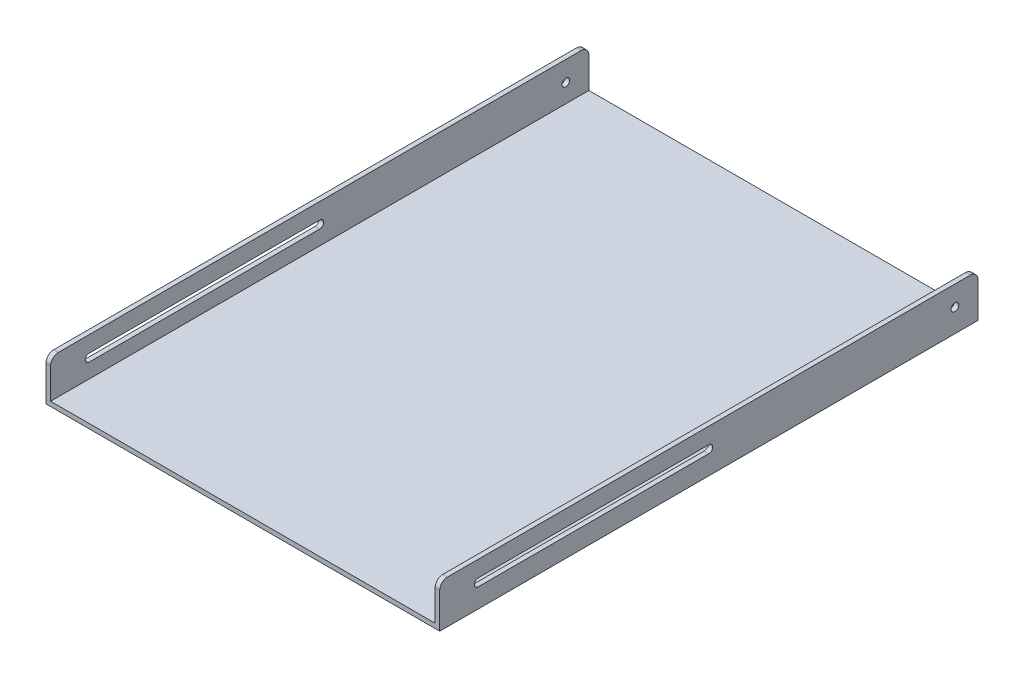
ISO-10303-21;
HEADER;
FILE_DESCRIPTION(('STEP AP214'),'2;1');
FILE_NAME('part.step','',(''),(''),'','','');
FILE_SCHEMA(('AUTOMOTIVE_DESIGN { 1 0 10303 214 1 1 1 1 }'));
ENDSEC;
DATA;
#1=APPLICATION_CONTEXT('core data for automotive mechanical design processes');
#2=APPLICATION_PROTOCOL_DEFINITION('international standard','automotive_design',2000,#1);
#3=PRODUCT_CONTEXT('',#1,'mechanical');
#4=PRODUCT('Part','Part','',(#3));
#5=PRODUCT_RELATED_PRODUCT_CATEGORY('part','',(#4));
#6=PRODUCT_DEFINITION_FORMATION('','',#4);
#7=PRODUCT_DEFINITION_CONTEXT('part definition',#1,'design');
#8=PRODUCT_DEFINITION('design','',#6,#7);
#9=PRODUCT_DEFINITION_SHAPE('','',#8);
#10=(LENGTH_UNIT() NAMED_UNIT(*) SI_UNIT(.MILLI.,.METRE.));
#11=(NAMED_UNIT(*) PLANE_ANGLE_UNIT() SI_UNIT($,.RADIAN.));
#12=(NAMED_UNIT(*) SI_UNIT($,.STERADIAN.) SOLID_ANGLE_UNIT());
#13=UNCERTAINTY_MEASURE_WITH_UNIT(LENGTH_MEASURE(1.E-05),#10,'distance_accuracy_value','');
#14=(GEOMETRIC_REPRESENTATION_CONTEXT(3) GLOBAL_UNCERTAINTY_ASSIGNED_CONTEXT((#13)) GLOBAL_UNIT_ASSIGNED_CONTEXT((#10,
#11,#12)) REPRESENTATION_CONTEXT('',''));
#15=CARTESIAN_POINT('',(0.,0.,0.));
#16=DIRECTION('',(0.,0.,1.));
#17=DIRECTION('',(1.,0.,0.));
#18=AXIS2_PLACEMENT_3D('',#15,#16,#17);
#19=CARTESIAN_POINT('',(256.,0.,350.));
#20=DIRECTION('',(-1.,0.,0.));
#21=DIRECTION('',(0.,0.,1.));
#22=AXIS2_PLACEMENT_3D('',#19,#20,#21);
#23=PLANE('',#22);
#24=CARTESIAN_POINT('',(256.,24.,-320.));
#25=DIRECTION('',(1.,0.,0.));
#26=DIRECTION('',(0.,0.,-1.));
#27=AXIS2_PLACEMENT_3D('',#24,#25,#26);
#28=CIRCLE('',#27,4.99999999999999);
#29=CARTESIAN_POINT('',(256.,24.,-325.));
#30=VERTEX_POINT('',#29);
#31=EDGE_CURVE('E210',#30,#30,#28,.T.);
#32=ORIENTED_EDGE('',*,*,#31,.F.);
#33=EDGE_LOOP('',(#32));
#34=FACE_BOUND('',#33,.T.);
#35=DIRECTION('',(0.,0.,-1.));
#36=VECTOR('',#35,1.);
#37=CARTESIAN_POINT('',(256.,19.,300.));
#38=LINE('',#37,#36);
#39=CARTESIAN_POINT('',(256.,19.,300.));
#40=VERTEX_POINT('',#39);
#41=CARTESIAN_POINT('',(256.,19.,0.));
#42=VERTEX_POINT('',#41);
#43=EDGE_CURVE('E217',#40,#42,#38,.T.);
#44=ORIENTED_EDGE('',*,*,#43,.F.);
#45=CARTESIAN_POINT('',(256.,24.,300.));
#46=DIRECTION('',(1.,0.,0.));
#47=DIRECTION('',(0.,0.,-1.));
#48=AXIS2_PLACEMENT_3D('',#45,#46,#47);
#49=CIRCLE('',#48,5.);
#50=CARTESIAN_POINT('',(256.,29.,300.));
#51=VERTEX_POINT('',#50);
#52=EDGE_CURVE('E215',#51,#40,#49,.T.);
#53=ORIENTED_EDGE('',*,*,#52,.F.);
#54=DIRECTION('',(0.,0.,1.));
#55=VECTOR('',#54,1.);
#56=CARTESIAN_POINT('',(256.,29.,300.));
#57=LINE('',#56,#55);
#58=CARTESIAN_POINT('',(256.,29.,0.));
#59=VERTEX_POINT('',#58);
#60=EDGE_CURVE('E204',#59,#51,#57,.T.);
#61=ORIENTED_EDGE('',*,*,#60,.F.);
#62=CARTESIAN_POINT('',(256.,24.,0.));
#63=DIRECTION('',(1.,0.,0.));
#64=DIRECTION('',(0.,0.,-1.));
#65=AXIS2_PLACEMENT_3D('',#62,#63,#64);
#66=CIRCLE('',#65,5.);
#67=EDGE_CURVE('E207',#42,#59,#66,.T.);
#68=ORIENTED_EDGE('',*,*,#67,.F.);
#69=EDGE_LOOP('',(#44,#53,#61,#68));
#70=FACE_BOUND('',#69,.T.);
#71=DIRECTION('',(0.,0.,-1.));
#72=VECTOR('',#71,1.);
#73=CARTESIAN_POINT('',(256.,50.,350.));
#74=LINE('',#73,#72);
#75=CARTESIAN_POINT('',(256.,50.,340.));
#76=VERTEX_POINT('',#75);
#77=CARTESIAN_POINT('',(256.,50.,-340.));
#78=VERTEX_POINT('',#77);
#79=EDGE_CURVE('E302',#76,#78,#74,.T.);
#80=ORIENTED_EDGE('',*,*,#79,.F.);
#81=CARTESIAN_POINT('',(256.,40.,340.));
#82=DIRECTION('',(-1.,0.,0.));
#83=DIRECTION('',(0.,0.,1.));
#84=AXIS2_PLACEMENT_3D('',#81,#82,#83);
#85=CIRCLE('',#84,10.);
#86=CARTESIAN_POINT('',(256.,40.,350.));
#87=VERTEX_POINT('',#86);
#88=EDGE_CURVE('E312',#76,#87,#85,.F.);
#89=ORIENTED_EDGE('',*,*,#88,.T.);
#90=DIRECTION('',(0.,1.,0.));
#91=VECTOR('',#90,1.);
#92=CARTESIAN_POINT('',(256.,0.,350.));
#93=LINE('',#92,#91);
#94=CARTESIAN_POINT('',(256.,-6.,350.));
#95=VERTEX_POINT('',#94);
#96=EDGE_CURVE('E254',#95,#87,#93,.T.);
#97=ORIENTED_EDGE('',*,*,#96,.F.);
#98=DIRECTION('',(0.,0.,-1.));
#99=VECTOR('',#98,1.);
#100=CARTESIAN_POINT('',(256.,-6.,350.));
#101=LINE('',#100,#99);
#102=CARTESIAN_POINT('',(256.,-6.,-350.));
#103=VERTEX_POINT('',#102);
#104=EDGE_CURVE('E270',#95,#103,#101,.T.);
#105=ORIENTED_EDGE('',*,*,#104,.T.);
#106=DIRECTION('',(0.,1.,0.));
#107=VECTOR('',#106,1.);
#108=CARTESIAN_POINT('',(256.,0.,-350.));
#109=LINE('',#108,#107);
#110=CARTESIAN_POINT('',(256.,40.,-350.));
#111=VERTEX_POINT('',#110);
#112=EDGE_CURVE('E253',#103,#111,#109,.T.);
#113=ORIENTED_EDGE('',*,*,#112,.T.);
#114=CARTESIAN_POINT('',(256.,40.,-340.));
#115=DIRECTION('',(-1.,0.,0.));
#116=DIRECTION('',(0.,0.,1.));
#117=AXIS2_PLACEMENT_3D('',#114,#115,#116);
#118=CIRCLE('',#117,10.);
#119=EDGE_CURVE('E310',#111,#78,#118,.F.);
#120=ORIENTED_EDGE('',*,*,#119,.T.);
#121=EDGE_LOOP('',(#80,#89,#97,#105,#113,#120));
#122=FACE_BOUND('',#121,.T.);
#123=ADVANCED_FACE('F39',(#34,#70,#122),#23,.F.);
#124=CARTESIAN_POINT('',(250.,50.,350.));
#125=DIRECTION('',(0.,1.,0.));
#126=DIRECTION('',(0.,0.,1.));
#127=AXIS2_PLACEMENT_3D('',#124,#125,#126);
#128=PLANE('',#127);
#129=DIRECTION('',(0.,0.,-1.));
#130=VECTOR('',#129,1.);
#131=CARTESIAN_POINT('',(250.,50.,350.));
#132=LINE('',#131,#130);
#133=CARTESIAN_POINT('',(250.,50.,340.));
#134=VERTEX_POINT('',#133);
#135=CARTESIAN_POINT('',(250.,50.,-340.));
#136=VERTEX_POINT('',#135);
#137=EDGE_CURVE('E299',#134,#136,#132,.T.);
#138=ORIENTED_EDGE('',*,*,#137,.F.);
#139=DIRECTION('',(1.,0.,0.));
#140=VECTOR('',#139,1.);
#141=CARTESIAN_POINT('',(256.,50.,340.));
#142=LINE('',#141,#140);
#143=EDGE_CURVE('E307',#134,#76,#142,.T.);
#144=ORIENTED_EDGE('',*,*,#143,.T.);
#145=ORIENTED_EDGE('',*,*,#79,.T.);
#146=DIRECTION('',(1.,0.,0.));
#147=VECTOR('',#146,1.);
#148=CARTESIAN_POINT('',(250.,50.,-340.));
#149=LINE('',#148,#147);
#150=EDGE_CURVE('E305',#78,#136,#149,.F.);
#151=ORIENTED_EDGE('',*,*,#150,.T.);
#152=EDGE_LOOP('',(#138,#144,#145,#151));
#153=FACE_BOUND('',#152,.T.);
#154=ADVANCED_FACE('F375',(#153),#128,.T.);
#155=CARTESIAN_POINT('',(250.,0.,350.));
#156=DIRECTION('',(-1.,0.,0.));
#157=DIRECTION('',(0.,0.,1.));
#158=AXIS2_PLACEMENT_3D('',#155,#156,#157);
#159=PLANE('',#158);
#160=CARTESIAN_POINT('',(250.,24.,-320.));
#161=DIRECTION('',(-1.,0.,0.));
#162=DIRECTION('',(0.,0.,1.));
#163=AXIS2_PLACEMENT_3D('',#160,#161,#162);
#164=CIRCLE('',#163,4.99999999999999);
#165=CARTESIAN_POINT('',(250.,24.,-315.));
#166=VERTEX_POINT('',#165);
#167=EDGE_CURVE('E250',#166,#166,#164,.T.);
#168=ORIENTED_EDGE('',*,*,#167,.F.);
#169=EDGE_LOOP('',(#168));
#170=FACE_BOUND('',#169,.T.);
#171=CARTESIAN_POINT('',(250.,24.,300.));
#172=DIRECTION('',(-1.,0.,0.));
#173=DIRECTION('',(0.,0.,1.));
#174=AXIS2_PLACEMENT_3D('',#171,#172,#173);
#175=CIRCLE('',#174,5.);
#176=CARTESIAN_POINT('',(250.,19.,300.));
#177=VERTEX_POINT('',#176);
#178=CARTESIAN_POINT('',(250.,29.,300.));
#179=VERTEX_POINT('',#178);
#180=EDGE_CURVE('E245',#177,#179,#175,.T.);
#181=ORIENTED_EDGE('',*,*,#180,.F.);
#182=DIRECTION('',(0.,0.,1.));
#183=VECTOR('',#182,1.);
#184=CARTESIAN_POINT('',(250.,18.9999999999999,350.));
#185=LINE('',#184,#183);
#186=CARTESIAN_POINT('',(250.,19.,0.));
#187=VERTEX_POINT('',#186);
#188=EDGE_CURVE('E232',#187,#177,#185,.T.);
#189=ORIENTED_EDGE('',*,*,#188,.F.);
#190=CARTESIAN_POINT('',(250.,24.,0.));
#191=DIRECTION('',(-1.,0.,0.));
#192=DIRECTION('',(0.,0.,1.));
#193=AXIS2_PLACEMENT_3D('',#190,#191,#192);
#194=CIRCLE('',#193,5.);
#195=CARTESIAN_POINT('',(250.,29.,0.));
#196=VERTEX_POINT('',#195);
#197=EDGE_CURVE('E237',#196,#187,#194,.T.);
#198=ORIENTED_EDGE('',*,*,#197,.F.);
#199=DIRECTION('',(0.,0.,-1.));
#200=VECTOR('',#199,1.);
#201=CARTESIAN_POINT('',(250.,29.,350.));
#202=LINE('',#201,#200);
#203=EDGE_CURVE('E242',#179,#196,#202,.T.);
#204=ORIENTED_EDGE('',*,*,#203,.F.);
#205=EDGE_LOOP('',(#181,#189,#198,#204));
#206=FACE_BOUND('',#205,.T.);
#207=DIRECTION('',(0.,1.,0.));
#208=VECTOR('',#207,1.);
#209=CARTESIAN_POINT('',(250.,0.,350.));
#210=LINE('',#209,#208);
#211=CARTESIAN_POINT('',(250.,0.,350.));
#212=VERTEX_POINT('',#211);
#213=CARTESIAN_POINT('',(250.,40.,350.));
#214=VERTEX_POINT('',#213);
#215=EDGE_CURVE('E257',#212,#214,#210,.T.);
#216=ORIENTED_EDGE('',*,*,#215,.T.);
#217=CARTESIAN_POINT('',(250.,40.,340.));
#218=DIRECTION('',(-1.,0.,0.));
#219=DIRECTION('',(0.,0.,1.));
#220=AXIS2_PLACEMENT_3D('',#217,#218,#219);
#221=CIRCLE('',#220,10.);
#222=EDGE_CURVE('E320',#214,#134,#221,.T.);
#223=ORIENTED_EDGE('',*,*,#222,.T.);
#224=ORIENTED_EDGE('',*,*,#137,.T.);
#225=CARTESIAN_POINT('',(250.,40.,-340.));
#226=DIRECTION('',(-1.,0.,0.));
#227=DIRECTION('',(0.,0.,1.));
#228=AXIS2_PLACEMENT_3D('',#225,#226,#227);
#229=CIRCLE('',#228,10.);
#230=CARTESIAN_POINT('',(250.,40.,-350.));
#231=VERTEX_POINT('',#230);
#232=EDGE_CURVE('E318',#136,#231,#229,.T.);
#233=ORIENTED_EDGE('',*,*,#232,.T.);
#234=DIRECTION('',(0.,1.,0.));
#235=VECTOR('',#234,1.);
#236=CARTESIAN_POINT('',(250.,0.,-350.));
#237=LINE('',#236,#235);
#238=CARTESIAN_POINT('',(250.,0.,-350.));
#239=VERTEX_POINT('',#238);
#240=EDGE_CURVE('E273',#239,#231,#237,.T.);
#241=ORIENTED_EDGE('',*,*,#240,.F.);
#242=DIRECTION('',(0.,0.,-1.));
#243=VECTOR('',#242,1.);
#244=CARTESIAN_POINT('',(250.,0.,350.));
#245=LINE('',#244,#243);
#246=EDGE_CURVE('E297',#212,#239,#245,.T.);
#247=ORIENTED_EDGE('',*,*,#246,.F.);
#248=EDGE_LOOP('',(#216,#223,#224,#233,#241,#247));
#249=FACE_BOUND('',#248,.T.);
#250=ADVANCED_FACE('F371',(#170,#206,#249),#159,.T.);
#251=CARTESIAN_POINT('',(-250.,0.,350.));
#252=DIRECTION('',(0.,1.,0.));
#253=DIRECTION('',(0.,0.,1.));
#254=AXIS2_PLACEMENT_3D('',#251,#252,#253);
#255=PLANE('',#254);
#256=DIRECTION('',(1.,0.,0.));
#257=VECTOR('',#256,1.);
#258=CARTESIAN_POINT('',(-250.,0.,-350.));
#259=LINE('',#258,#257);
#260=CARTESIAN_POINT('',(-250.,0.,-350.));
#261=VERTEX_POINT('',#260);
#262=EDGE_CURVE('E276',#261,#239,#259,.T.);
#263=ORIENTED_EDGE('',*,*,#262,.F.);
#264=DIRECTION('',(0.,0.,-1.));
#265=VECTOR('',#264,1.);
#266=CARTESIAN_POINT('',(-250.,0.,350.));
#267=LINE('',#266,#265);
#268=CARTESIAN_POINT('',(-250.,0.,350.));
#269=VERTEX_POINT('',#268);
#270=EDGE_CURVE('E294',#269,#261,#267,.T.);
#271=ORIENTED_EDGE('',*,*,#270,.F.);
#272=DIRECTION('',(1.,0.,0.));
#273=VECTOR('',#272,1.);
#274=CARTESIAN_POINT('',(-250.,0.,350.));
#275=LINE('',#274,#273);
#276=EDGE_CURVE('E261',#269,#212,#275,.T.);
#277=ORIENTED_EDGE('',*,*,#276,.T.);
#278=ORIENTED_EDGE('',*,*,#246,.T.);
#279=EDGE_LOOP('',(#263,#271,#277,#278));
#280=FACE_BOUND('',#279,.T.);
#281=ADVANCED_FACE('F367',(#280),#255,.T.);
#282=CARTESIAN_POINT('',(-250.,50.,350.));
#283=DIRECTION('',(1.,0.,0.));
#284=DIRECTION('',(0.,0.,-1.));
#285=AXIS2_PLACEMENT_3D('',#282,#283,#284);
#286=PLANE('',#285);
#287=CARTESIAN_POINT('',(-250.,24.,-320.));
#288=DIRECTION('',(1.,0.,0.));
#289=DIRECTION('',(0.,0.,-1.));
#290=AXIS2_PLACEMENT_3D('',#287,#288,#289);
#291=CIRCLE('',#290,4.99999999999999);
#292=CARTESIAN_POINT('',(-250.,24.,-325.));
#293=VERTEX_POINT('',#292);
#294=EDGE_CURVE('E247',#293,#293,#291,.T.);
#295=ORIENTED_EDGE('',*,*,#294,.F.);
#296=EDGE_LOOP('',(#295));
#297=FACE_BOUND('',#296,.T.);
#298=CARTESIAN_POINT('',(-250.,24.,300.));
#299=DIRECTION('',(1.,0.,0.));
#300=DIRECTION('',(0.,0.,-1.));
#301=AXIS2_PLACEMENT_3D('',#298,#299,#300);
#302=CIRCLE('',#301,5.);
#303=CARTESIAN_POINT('',(-250.,29.,300.));
#304=VERTEX_POINT('',#303);
#305=CARTESIAN_POINT('',(-250.,19.,300.));
#306=VERTEX_POINT('',#305);
#307=EDGE_CURVE('E185',#304,#306,#302,.T.);
#308=ORIENTED_EDGE('',*,*,#307,.F.);
#309=DIRECTION('',(0.,0.,1.));
#310=VECTOR('',#309,1.);
#311=CARTESIAN_POINT('',(-250.,29.,350.));
#312=LINE('',#311,#310);
#313=CARTESIAN_POINT('',(-250.,29.,0.));
#314=VERTEX_POINT('',#313);
#315=EDGE_CURVE('E240',#314,#304,#312,.T.);
#316=ORIENTED_EDGE('',*,*,#315,.F.);
#317=CARTESIAN_POINT('',(-250.,24.,0.));
#318=DIRECTION('',(1.,0.,0.));
#319=DIRECTION('',(0.,0.,-1.));
#320=AXIS2_PLACEMENT_3D('',#317,#318,#319);
#321=CIRCLE('',#320,5.);
#322=CARTESIAN_POINT('',(-250.,19.,0.));
#323=VERTEX_POINT('',#322);
#324=EDGE_CURVE('E235',#323,#314,#321,.T.);
#325=ORIENTED_EDGE('',*,*,#324,.F.);
#326=DIRECTION('',(0.,0.,-1.));
#327=VECTOR('',#326,1.);
#328=CARTESIAN_POINT('',(-250.,18.9999999999999,350.));
#329=LINE('',#328,#327);
#330=EDGE_CURVE('E230',#306,#323,#329,.T.);
#331=ORIENTED_EDGE('',*,*,#330,.F.);
#332=EDGE_LOOP('',(#308,#316,#325,#331));
#333=FACE_BOUND('',#332,.T.);
#334=DIRECTION('',(0.,0.,-1.));
#335=VECTOR('',#334,1.);
#336=CARTESIAN_POINT('',(-250.,50.,350.));
#337=LINE('',#336,#335);
#338=CARTESIAN_POINT('',(-250.,50.,340.));
#339=VERTEX_POINT('',#338);
#340=CARTESIAN_POINT('',(-250.,50.,-340.));
#341=VERTEX_POINT('',#340);
#342=EDGE_CURVE('E291',#339,#341,#337,.T.);
#343=ORIENTED_EDGE('',*,*,#342,.F.);
#344=CARTESIAN_POINT('',(-250.,40.,340.));
#345=DIRECTION('',(1.,0.,0.));
#346=DIRECTION('',(0.,0.,-1.));
#347=AXIS2_PLACEMENT_3D('',#344,#345,#346);
#348=CIRCLE('',#347,10.);
#349=CARTESIAN_POINT('',(-250.,40.,350.));
#350=VERTEX_POINT('',#349);
#351=EDGE_CURVE('E328',#339,#350,#348,.T.);
#352=ORIENTED_EDGE('',*,*,#351,.T.);
#353=DIRECTION('',(0.,-1.,0.));
#354=VECTOR('',#353,1.);
#355=CARTESIAN_POINT('',(-250.,50.,350.));
#356=LINE('',#355,#354);
#357=EDGE_CURVE('E264',#350,#269,#356,.T.);
#358=ORIENTED_EDGE('',*,*,#357,.T.);
#359=ORIENTED_EDGE('',*,*,#270,.T.);
#360=DIRECTION('',(0.,-1.,0.));
#361=VECTOR('',#360,1.);
#362=CARTESIAN_POINT('',(-250.,50.,-350.));
#363=LINE('',#362,#361);
#364=CARTESIAN_POINT('',(-250.,40.,-350.));
#365=VERTEX_POINT('',#364);
#366=EDGE_CURVE('E279',#365,#261,#363,.T.);
#367=ORIENTED_EDGE('',*,*,#366,.F.);
#368=CARTESIAN_POINT('',(-250.,40.,-340.));
#369=DIRECTION('',(1.,0.,0.));
#370=DIRECTION('',(0.,0.,-1.));
#371=AXIS2_PLACEMENT_3D('',#368,#369,#370);
#372=CIRCLE('',#371,10.);
#373=EDGE_CURVE('E62',#365,#341,#372,.T.);
#374=ORIENTED_EDGE('',*,*,#373,.T.);
#375=EDGE_LOOP('',(#343,#352,#358,#359,#367,#374));
#376=FACE_BOUND('',#375,.T.);
#377=ADVANCED_FACE('F362',(#297,#333,#376),#286,.T.);
#378=CARTESIAN_POINT('',(-256.,50.,350.));
#379=DIRECTION('',(0.,1.,0.));
#380=DIRECTION('',(0.,0.,1.));
#381=AXIS2_PLACEMENT_3D('',#378,#379,#380);
#382=PLANE('',#381);
#383=DIRECTION('',(0.,0.,-1.));
#384=VECTOR('',#383,1.);
#385=CARTESIAN_POINT('',(-256.,50.,350.));
#386=LINE('',#385,#384);
#387=CARTESIAN_POINT('',(-256.,50.,340.));
#388=VERTEX_POINT('',#387);
#389=CARTESIAN_POINT('',(-256.,50.,-340.));
#390=VERTEX_POINT('',#389);
#391=EDGE_CURVE('E289',#388,#390,#386,.T.);
#392=ORIENTED_EDGE('',*,*,#391,.F.);
#393=DIRECTION('',(1.,0.,0.));
#394=VECTOR('',#393,1.);
#395=CARTESIAN_POINT('',(-250.,50.,340.));
#396=LINE('',#395,#394);
#397=EDGE_CURVE('E324',#388,#339,#396,.T.);
#398=ORIENTED_EDGE('',*,*,#397,.T.);
#399=ORIENTED_EDGE('',*,*,#342,.T.);
#400=DIRECTION('',(1.,0.,0.));
#401=VECTOR('',#400,1.);
#402=CARTESIAN_POINT('',(-256.,50.,-340.));
#403=LINE('',#402,#401);
#404=EDGE_CURVE('E322',#341,#390,#403,.F.);
#405=ORIENTED_EDGE('',*,*,#404,.T.);
#406=EDGE_LOOP('',(#392,#398,#399,#405));
#407=FACE_BOUND('',#406,.T.);
#408=ADVANCED_FACE('F353',(#407),#382,.T.);
#409=CARTESIAN_POINT('',(-256.,50.,350.));
#410=DIRECTION('',(1.,0.,0.));
#411=DIRECTION('',(0.,0.,-1.));
#412=AXIS2_PLACEMENT_3D('',#409,#410,#411);
#413=PLANE('',#412);
#414=CARTESIAN_POINT('',(-256.,24.,-320.));
#415=DIRECTION('',(1.,0.,0.));
#416=DIRECTION('',(0.,0.,-1.));
#417=AXIS2_PLACEMENT_3D('',#414,#415,#416);
#418=CIRCLE('',#417,4.99999999999999);
#419=CARTESIAN_POINT('',(-256.,24.,-325.));
#420=VERTEX_POINT('',#419);
#421=EDGE_CURVE('E233',#420,#420,#418,.T.);
#422=ORIENTED_EDGE('',*,*,#421,.T.);
#423=EDGE_LOOP('',(#422));
#424=FACE_BOUND('',#423,.T.);
#425=DIRECTION('',(0.,0.,1.));
#426=VECTOR('',#425,1.);
#427=CARTESIAN_POINT('',(-256.,29.,300.));
#428=LINE('',#427,#426);
#429=CARTESIAN_POINT('',(-256.,29.,0.));
#430=VERTEX_POINT('',#429);
#431=CARTESIAN_POINT('',(-256.,29.,300.));
#432=VERTEX_POINT('',#431);
#433=EDGE_CURVE('E203',#430,#432,#428,.T.);
#434=ORIENTED_EDGE('',*,*,#433,.T.);
#435=CARTESIAN_POINT('',(-256.,24.,300.));
#436=DIRECTION('',(1.,0.,0.));
#437=DIRECTION('',(0.,0.,-1.));
#438=AXIS2_PLACEMENT_3D('',#435,#436,#437);
#439=CIRCLE('',#438,5.);
#440=CARTESIAN_POINT('',(-256.,19.,300.));
#441=VERTEX_POINT('',#440);
#442=EDGE_CURVE('E182',#432,#441,#439,.T.);
#443=ORIENTED_EDGE('',*,*,#442,.T.);
#444=DIRECTION('',(0.,0.,-1.));
#445=VECTOR('',#444,1.);
#446=CARTESIAN_POINT('',(-256.,19.,300.));
#447=LINE('',#446,#445);
#448=CARTESIAN_POINT('',(-256.,19.,0.));
#449=VERTEX_POINT('',#448);
#450=EDGE_CURVE('E193',#441,#449,#447,.T.);
#451=ORIENTED_EDGE('',*,*,#450,.T.);
#452=CARTESIAN_POINT('',(-256.,24.,0.));
#453=DIRECTION('',(1.,0.,0.));
#454=DIRECTION('',(0.,0.,-1.));
#455=AXIS2_PLACEMENT_3D('',#452,#453,#454);
#456=CIRCLE('',#455,5.);
#457=EDGE_CURVE('E199',#449,#430,#456,.T.);
#458=ORIENTED_EDGE('',*,*,#457,.T.);
#459=EDGE_LOOP('',(#434,#443,#451,#458));
#460=FACE_BOUND('',#459,.T.);
#461=DIRECTION('',(0.,1.,0.));
#462=VECTOR('',#461,1.);
#463=CARTESIAN_POINT('',(-256.,50.,350.));
#464=LINE('',#463,#462);
#465=CARTESIAN_POINT('',(-256.,40.,350.));
#466=VERTEX_POINT('',#465);
#467=CARTESIAN_POINT('',(-256.,-6.,350.));
#468=VERTEX_POINT('',#467);
#469=EDGE_CURVE('E266',#466,#468,#464,.F.);
#470=ORIENTED_EDGE('',*,*,#469,.F.);
#471=CARTESIAN_POINT('',(-256.,40.,340.));
#472=DIRECTION('',(1.,0.,0.));
#473=DIRECTION('',(0.,0.,-1.));
#474=AXIS2_PLACEMENT_3D('',#471,#472,#473);
#475=CIRCLE('',#474,10.);
#476=EDGE_CURVE('E331',#466,#388,#475,.F.);
#477=ORIENTED_EDGE('',*,*,#476,.T.);
#478=ORIENTED_EDGE('',*,*,#391,.T.);
#479=CARTESIAN_POINT('',(-256.,40.,-340.));
#480=DIRECTION('',(1.,0.,0.));
#481=DIRECTION('',(0.,0.,-1.));
#482=AXIS2_PLACEMENT_3D('',#479,#480,#481);
#483=CIRCLE('',#482,10.);
#484=CARTESIAN_POINT('',(-256.,40.,-350.));
#485=VERTEX_POINT('',#484);
#486=EDGE_CURVE('E54',#390,#485,#483,.F.);
#487=ORIENTED_EDGE('',*,*,#486,.T.);
#488=DIRECTION('',(0.,1.,0.));
#489=VECTOR('',#488,1.);
#490=CARTESIAN_POINT('',(-256.,50.,-350.));
#491=LINE('',#490,#489);
#492=CARTESIAN_POINT('',(-256.,-6.,-350.));
#493=VERTEX_POINT('',#492);
#494=EDGE_CURVE('E281',#485,#493,#491,.F.);
#495=ORIENTED_EDGE('',*,*,#494,.T.);
#496=DIRECTION('',(0.,0.,-1.));
#497=VECTOR('',#496,1.);
#498=CARTESIAN_POINT('',(-256.,-6.,350.));
#499=LINE('',#498,#497);
#500=EDGE_CURVE('E286',#468,#493,#499,.T.);
#501=ORIENTED_EDGE('',*,*,#500,.F.);
#502=EDGE_LOOP('',(#470,#477,#478,#487,#495,#501));
#503=FACE_BOUND('',#502,.T.);
#504=ADVANCED_FACE('F201',(#424,#460,#503),#413,.F.);
#505=CARTESIAN_POINT('',(-250.,-6.,350.));
#506=DIRECTION('',(0.,1.,0.));
#507=DIRECTION('',(0.,0.,1.));
#508=AXIS2_PLACEMENT_3D('',#505,#506,#507);
#509=PLANE('',#508);
#510=DIRECTION('',(1.,0.,0.));
#511=VECTOR('',#510,1.);
#512=CARTESIAN_POINT('',(-250.,-6.,-350.));
#513=LINE('',#512,#511);
#514=EDGE_CURVE('E258',#493,#103,#513,.T.);
#515=ORIENTED_EDGE('',*,*,#514,.T.);
#516=ORIENTED_EDGE('',*,*,#104,.F.);
#517=DIRECTION('',(1.,0.,0.));
#518=VECTOR('',#517,1.);
#519=CARTESIAN_POINT('',(-250.,-6.,350.));
#520=LINE('',#519,#518);
#521=EDGE_CURVE('E268',#468,#95,#520,.T.);
#522=ORIENTED_EDGE('',*,*,#521,.F.);
#523=ORIENTED_EDGE('',*,*,#500,.T.);
#524=EDGE_LOOP('',(#515,#516,#522,#523));
#525=FACE_BOUND('',#524,.T.);
#526=ADVANCED_FACE('F347',(#525),#509,.F.);
#527=CARTESIAN_POINT('',(0.,0.,350.));
#528=DIRECTION('',(0.,0.,-1.));
#529=DIRECTION('',(-1.,0.,0.));
#530=AXIS2_PLACEMENT_3D('',#527,#528,#529);
#531=PLANE('',#530);
#532=ORIENTED_EDGE('',*,*,#96,.T.);
#533=DIRECTION('',(1.,0.,0.));
#534=VECTOR('',#533,1.);
#535=CARTESIAN_POINT('',(250.,40.,350.));
#536=LINE('',#535,#534);
#537=EDGE_CURVE('E316',#87,#214,#536,.F.);
#538=ORIENTED_EDGE('',*,*,#537,.T.);
#539=ORIENTED_EDGE('',*,*,#215,.F.);
#540=ORIENTED_EDGE('',*,*,#276,.F.);
#541=ORIENTED_EDGE('',*,*,#357,.F.);
#542=DIRECTION('',(1.,0.,0.));
#543=VECTOR('',#542,1.);
#544=CARTESIAN_POINT('',(-256.,40.,350.));
#545=LINE('',#544,#543);
#546=EDGE_CURVE('E314',#350,#466,#545,.F.);
#547=ORIENTED_EDGE('',*,*,#546,.T.);
#548=ORIENTED_EDGE('',*,*,#469,.T.);
#549=ORIENTED_EDGE('',*,*,#521,.T.);
#550=EDGE_LOOP('',(#532,#538,#539,#540,#541,#547,#548,#549));
#551=FACE_BOUND('',#550,.T.);
#552=ADVANCED_FACE('F380',(#551),#531,.F.);
#553=CARTESIAN_POINT('',(0.,0.,-350.));
#554=DIRECTION('',(0.,0.,-1.));
#555=DIRECTION('',(-1.,0.,0.));
#556=AXIS2_PLACEMENT_3D('',#553,#554,#555);
#557=PLANE('',#556);
#558=ORIENTED_EDGE('',*,*,#494,.F.);
#559=DIRECTION('',(1.,0.,0.));
#560=VECTOR('',#559,1.);
#561=CARTESIAN_POINT('',(0.,40.,-350.));
#562=LINE('',#561,#560);
#563=EDGE_CURVE('E11',#485,#365,#562,.T.);
#564=ORIENTED_EDGE('',*,*,#563,.T.);
#565=ORIENTED_EDGE('',*,*,#366,.T.);
#566=ORIENTED_EDGE('',*,*,#262,.T.);
#567=ORIENTED_EDGE('',*,*,#240,.T.);
#568=DIRECTION('',(1.,0.,0.));
#569=VECTOR('',#568,1.);
#570=CARTESIAN_POINT('',(0.,40.,-350.));
#571=LINE('',#570,#569);
#572=EDGE_CURVE('E47',#231,#111,#571,.T.);
#573=ORIENTED_EDGE('',*,*,#572,.T.);
#574=ORIENTED_EDGE('',*,*,#112,.F.);
#575=ORIENTED_EDGE('',*,*,#514,.F.);
#576=EDGE_LOOP('',(#558,#564,#565,#566,#567,#573,#574,#575));
#577=FACE_BOUND('',#576,.T.);
#578=ADVANCED_FACE('F336',(#577),#557,.T.);
#579=CARTESIAN_POINT('',(-256.,19.,300.));
#580=DIRECTION('',(0.,-1.,0.));
#581=DIRECTION('',(0.,0.,-1.));
#582=AXIS2_PLACEMENT_3D('',#579,#580,#581);
#583=PLANE('',#582);
#584=ORIENTED_EDGE('',*,*,#330,.T.);
#585=DIRECTION('',(1.,0.,0.));
#586=VECTOR('',#585,1.);
#587=CARTESIAN_POINT('',(-256.,19.,0.));
#588=LINE('',#587,#586);
#589=EDGE_CURVE('E196',#449,#323,#588,.T.);
#590=ORIENTED_EDGE('',*,*,#589,.F.);
#591=ORIENTED_EDGE('',*,*,#450,.F.);
#592=DIRECTION('',(1.,0.,0.));
#593=VECTOR('',#592,1.);
#594=CARTESIAN_POINT('',(-256.,19.,300.));
#595=LINE('',#594,#593);
#596=EDGE_CURVE('E177',#441,#306,#595,.T.);
#597=ORIENTED_EDGE('',*,*,#596,.T.);
#598=EDGE_LOOP('',(#584,#590,#591,#597));
#599=FACE_BOUND('',#598,.T.);
#600=ADVANCED_FACE('F194',(#599),#583,.F.);
#601=CARTESIAN_POINT('',(-256.,24.,0.));
#602=DIRECTION('',(1.,0.,0.));
#603=DIRECTION('',(0.,0.,-1.));
#604=AXIS2_PLACEMENT_3D('',#601,#602,#603);
#605=CYLINDRICAL_SURFACE('',#604,5.);
#606=ORIENTED_EDGE('',*,*,#324,.T.);
#607=DIRECTION('',(1.,0.,0.));
#608=VECTOR('',#607,1.);
#609=CARTESIAN_POINT('',(-256.,29.,0.));
#610=LINE('',#609,#608);
#611=EDGE_CURVE('E225',#430,#314,#610,.T.);
#612=ORIENTED_EDGE('',*,*,#611,.F.);
#613=ORIENTED_EDGE('',*,*,#457,.F.);
#614=ORIENTED_EDGE('',*,*,#589,.T.);
#615=EDGE_LOOP('',(#606,#612,#613,#614));
#616=FACE_BOUND('',#615,.T.);
#617=ADVANCED_FACE('F430',(#616),#605,.F.);
#618=CARTESIAN_POINT('',(-256.,29.,300.));
#619=DIRECTION('',(0.,1.,0.));
#620=DIRECTION('',(0.,0.,1.));
#621=AXIS2_PLACEMENT_3D('',#618,#619,#620);
#622=PLANE('',#621);
#623=ORIENTED_EDGE('',*,*,#315,.T.);
#624=DIRECTION('',(1.,0.,0.));
#625=VECTOR('',#624,1.);
#626=CARTESIAN_POINT('',(-256.,29.,300.));
#627=LINE('',#626,#625);
#628=EDGE_CURVE('E222',#432,#304,#627,.T.);
#629=ORIENTED_EDGE('',*,*,#628,.F.);
#630=ORIENTED_EDGE('',*,*,#433,.F.);
#631=ORIENTED_EDGE('',*,*,#611,.T.);
#632=EDGE_LOOP('',(#623,#629,#630,#631));
#633=FACE_BOUND('',#632,.T.);
#634=ADVANCED_FACE('F426',(#633),#622,.F.);
#635=CARTESIAN_POINT('',(-256.,24.,300.));
#636=DIRECTION('',(1.,0.,0.));
#637=DIRECTION('',(0.,0.,-1.));
#638=AXIS2_PLACEMENT_3D('',#635,#636,#637);
#639=CYLINDRICAL_SURFACE('',#638,5.);
#640=ORIENTED_EDGE('',*,*,#307,.T.);
#641=ORIENTED_EDGE('',*,*,#596,.F.);
#642=ORIENTED_EDGE('',*,*,#442,.F.);
#643=ORIENTED_EDGE('',*,*,#628,.T.);
#644=EDGE_LOOP('',(#640,#641,#642,#643));
#645=FACE_BOUND('',#644,.T.);
#646=ADVANCED_FACE('F179',(#645),#639,.F.);
#647=CARTESIAN_POINT('',(-256.,24.,-320.));
#648=DIRECTION('',(1.,0.,0.));
#649=DIRECTION('',(0.,0.,-1.));
#650=AXIS2_PLACEMENT_3D('',#647,#648,#649);
#651=CYLINDRICAL_SURFACE('',#650,4.99999999999999);
#652=ORIENTED_EDGE('',*,*,#294,.T.);
#653=EDGE_LOOP('',(#652));
#654=FACE_BOUND('',#653,.T.);
#655=ORIENTED_EDGE('',*,*,#421,.F.);
#656=EDGE_LOOP('',(#655));
#657=FACE_BOUND('',#656,.T.);
#658=ADVANCED_FACE('F394',(#654,#657),#651,.F.);
#659=ORIENTED_EDGE('',*,*,#180,.T.);
#660=EDGE_CURVE('E224',#179,#51,#627,.T.);
#661=ORIENTED_EDGE('',*,*,#660,.T.);
#662=ORIENTED_EDGE('',*,*,#52,.T.);
#663=EDGE_CURVE('E189',#177,#40,#595,.T.);
#664=ORIENTED_EDGE('',*,*,#663,.F.);
#665=EDGE_LOOP('',(#659,#661,#662,#664));
#666=FACE_BOUND('',#665,.T.);
#667=ADVANCED_FACE('F427',(#666),#639,.F.);
#668=ORIENTED_EDGE('',*,*,#203,.T.);
#669=EDGE_CURVE('E228',#196,#59,#610,.T.);
#670=ORIENTED_EDGE('',*,*,#669,.T.);
#671=ORIENTED_EDGE('',*,*,#60,.T.);
#672=ORIENTED_EDGE('',*,*,#660,.F.);
#673=EDGE_LOOP('',(#668,#670,#671,#672));
#674=FACE_BOUND('',#673,.T.);
#675=ADVANCED_FACE('F437',(#674),#622,.F.);
#676=ORIENTED_EDGE('',*,*,#197,.T.);
#677=EDGE_CURVE('E188',#187,#42,#588,.T.);
#678=ORIENTED_EDGE('',*,*,#677,.T.);
#679=ORIENTED_EDGE('',*,*,#67,.T.);
#680=ORIENTED_EDGE('',*,*,#669,.F.);
#681=EDGE_LOOP('',(#676,#678,#679,#680));
#682=FACE_BOUND('',#681,.T.);
#683=ADVANCED_FACE('F434',(#682),#605,.F.);
#684=ORIENTED_EDGE('',*,*,#188,.T.);
#685=ORIENTED_EDGE('',*,*,#663,.T.);
#686=ORIENTED_EDGE('',*,*,#43,.T.);
#687=ORIENTED_EDGE('',*,*,#677,.F.);
#688=EDGE_LOOP('',(#684,#685,#686,#687));
#689=FACE_BOUND('',#688,.T.);
#690=ADVANCED_FACE('F391',(#689),#583,.F.);
#691=ORIENTED_EDGE('',*,*,#167,.T.);
#692=EDGE_LOOP('',(#691));
#693=FACE_BOUND('',#692,.T.);
#694=ORIENTED_EDGE('',*,*,#31,.T.);
#695=EDGE_LOOP('',(#694));
#696=FACE_BOUND('',#695,.T.);
#697=ADVANCED_FACE('F384',(#693,#696),#651,.F.);
#698=CARTESIAN_POINT('',(250.,40.,340.));
#699=DIRECTION('',(-1.,0.,0.));
#700=DIRECTION('',(0.,0.,1.));
#701=AXIS2_PLACEMENT_3D('',#698,#699,#700);
#702=CYLINDRICAL_SURFACE('',#701,10.);
#703=ORIENTED_EDGE('',*,*,#222,.F.);
#704=ORIENTED_EDGE('',*,*,#537,.F.);
#705=ORIENTED_EDGE('',*,*,#88,.F.);
#706=ORIENTED_EDGE('',*,*,#143,.F.);
#707=EDGE_LOOP('',(#703,#704,#705,#706));
#708=FACE_BOUND('',#707,.T.);
#709=ADVANCED_FACE('F382',(#708),#702,.T.);
#710=CARTESIAN_POINT('',(-256.,40.,340.));
#711=DIRECTION('',(-1.,0.,0.));
#712=DIRECTION('',(0.,0.,1.));
#713=AXIS2_PLACEMENT_3D('',#710,#711,#712);
#714=CYLINDRICAL_SURFACE('',#713,10.);
#715=ORIENTED_EDGE('',*,*,#476,.F.);
#716=ORIENTED_EDGE('',*,*,#546,.F.);
#717=ORIENTED_EDGE('',*,*,#351,.F.);
#718=ORIENTED_EDGE('',*,*,#397,.F.);
#719=EDGE_LOOP('',(#715,#716,#717,#718));
#720=FACE_BOUND('',#719,.T.);
#721=ADVANCED_FACE('F360',(#720),#714,.T.);
#722=CARTESIAN_POINT('',(0.,40.,-340.));
#723=DIRECTION('',(1.,0.,0.));
#724=DIRECTION('',(0.,0.,-1.));
#725=AXIS2_PLACEMENT_3D('',#722,#723,#724);
#726=CYLINDRICAL_SURFACE('',#725,10.);
#727=ORIENTED_EDGE('',*,*,#486,.F.);
#728=ORIENTED_EDGE('',*,*,#404,.F.);
#729=ORIENTED_EDGE('',*,*,#373,.F.);
#730=ORIENTED_EDGE('',*,*,#563,.F.);
#731=EDGE_LOOP('',(#727,#728,#729,#730));
#732=FACE_BOUND('',#731,.T.);
#733=ADVANCED_FACE('F350',(#732),#726,.T.);
#734=CARTESIAN_POINT('',(0.,40.,-340.));
#735=DIRECTION('',(1.,0.,0.));
#736=DIRECTION('',(0.,0.,-1.));
#737=AXIS2_PLACEMENT_3D('',#734,#735,#736);
#738=CYLINDRICAL_SURFACE('',#737,10.);
#739=ORIENTED_EDGE('',*,*,#232,.F.);
#740=ORIENTED_EDGE('',*,*,#150,.F.);
#741=ORIENTED_EDGE('',*,*,#119,.F.);
#742=ORIENTED_EDGE('',*,*,#572,.F.);
#743=EDGE_LOOP('',(#739,#740,#741,#742));
#744=FACE_BOUND('',#743,.T.);
#745=ADVANCED_FACE('F41',(#744),#738,.T.);
#746=CLOSED_SHELL('',(#123,#154,#250,#281,#377,#408,#504,#526,#552,#578,#600,#617,#634,#646,
#658,#667,#675,#683,#690,#697,#709,#721,#733,#745));
#747=MANIFOLD_SOLID_BREP('B2',#746);
#748=ADVANCED_BREP_SHAPE_REPRESENTATION('',(#18,#747),#14);
#749=SHAPE_DEFINITION_REPRESENTATION(#9,#748);
ENDSEC;
END-ISO-10303-21;
